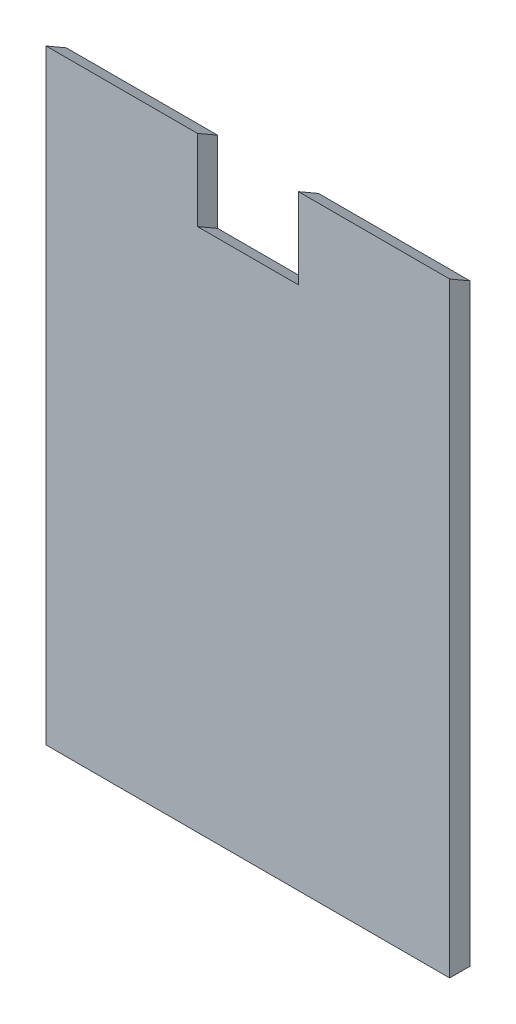
ISO-10303-21;
HEADER;
FILE_DESCRIPTION(('STEP AP214'),'2;1');
FILE_NAME('part.step','',(''),(''),'','','');
FILE_SCHEMA(('AUTOMOTIVE_DESIGN { 1 0 10303 214 1 1 1 1 }'));
ENDSEC;
DATA;
#1=APPLICATION_CONTEXT('core data for automotive mechanical design processes');
#2=APPLICATION_PROTOCOL_DEFINITION('international standard','automotive_design',2000,#1);
#3=PRODUCT_CONTEXT('',#1,'mechanical');
#4=PRODUCT('Part','Part','',(#3));
#5=PRODUCT_RELATED_PRODUCT_CATEGORY('part','',(#4));
#6=PRODUCT_DEFINITION_FORMATION('','',#4);
#7=PRODUCT_DEFINITION_CONTEXT('part definition',#1,'design');
#8=PRODUCT_DEFINITION('design','',#6,#7);
#9=PRODUCT_DEFINITION_SHAPE('','',#8);
#10=(LENGTH_UNIT() NAMED_UNIT(*) SI_UNIT(.MILLI.,.METRE.));
#11=(NAMED_UNIT(*) PLANE_ANGLE_UNIT() SI_UNIT($,.RADIAN.));
#12=(NAMED_UNIT(*) SI_UNIT($,.STERADIAN.) SOLID_ANGLE_UNIT());
#13=UNCERTAINTY_MEASURE_WITH_UNIT(LENGTH_MEASURE(1.E-05),#10,'distance_accuracy_value','');
#14=(GEOMETRIC_REPRESENTATION_CONTEXT(3) GLOBAL_UNCERTAINTY_ASSIGNED_CONTEXT((#13)) GLOBAL_UNIT_ASSIGNED_CONTEXT((#10,
#11,#12)) REPRESENTATION_CONTEXT('',''));
#15=CARTESIAN_POINT('',(0.,0.,0.));
#16=DIRECTION('',(0.,0.,1.));
#17=DIRECTION('',(1.,0.,0.));
#18=AXIS2_PLACEMENT_3D('',#15,#16,#17);
#19=CARTESIAN_POINT('',(-127.,-190.5,6.35));
#20=DIRECTION('',(1.,0.,0.));
#21=DIRECTION('',(0.,0.,-1.));
#22=AXIS2_PLACEMENT_3D('',#19,#20,#21);
#23=PLANE('',#22);
#24=DIRECTION('',(0.,-1.,0.));
#25=VECTOR('',#24,1.);
#26=CARTESIAN_POINT('',(-127.,-190.5,6.35));
#27=LINE('',#26,#25);
#28=CARTESIAN_POINT('',(-127.,190.5,6.35));
#29=VERTEX_POINT('',#28);
#30=CARTESIAN_POINT('',(-127.,-190.5,6.35));
#31=VERTEX_POINT('',#30);
#32=EDGE_CURVE('E106',#29,#31,#27,.T.);
#33=ORIENTED_EDGE('',*,*,#32,.F.);
#34=DIRECTION('',(0.,-0.500000000000002,-0.866025403784438));
#35=VECTOR('',#34,1.);
#36=CARTESIAN_POINT('',(-127.,190.5,6.35));
#37=LINE('',#36,#35);
#38=CARTESIAN_POINT('',(-127.,183.167651581292,-6.35));
#39=VERTEX_POINT('',#38);
#40=EDGE_CURVE('E96',#29,#39,#37,.T.);
#41=ORIENTED_EDGE('',*,*,#40,.T.);
#42=DIRECTION('',(0.,-1.,0.));
#43=VECTOR('',#42,1.);
#44=CARTESIAN_POINT('',(-127.,-190.5,-6.35));
#45=LINE('',#44,#43);
#46=CARTESIAN_POINT('',(-127.,-190.5,-6.35));
#47=VERTEX_POINT('',#46);
#48=EDGE_CURVE('E104',#39,#47,#45,.T.);
#49=ORIENTED_EDGE('',*,*,#48,.T.);
#50=DIRECTION('',(0.,0.,-1.));
#51=VECTOR('',#50,1.);
#52=CARTESIAN_POINT('',(-127.,-190.5,6.35));
#53=LINE('',#52,#51);
#54=EDGE_CURVE('E40',#31,#47,#53,.T.);
#55=ORIENTED_EDGE('',*,*,#54,.F.);
#56=EDGE_LOOP('',(#33,#41,#49,#55));
#57=FACE_BOUND('',#56,.T.);
#58=ADVANCED_FACE('F33',(#57),#23,.F.);
#59=CARTESIAN_POINT('',(127.,-190.5,6.35));
#60=DIRECTION('',(0.,1.,0.));
#61=DIRECTION('',(-1.,0.,0.));
#62=AXIS2_PLACEMENT_3D('',#59,#60,#61);
#63=PLANE('',#62);
#64=DIRECTION('',(1.,0.,0.));
#65=VECTOR('',#64,1.);
#66=CARTESIAN_POINT('',(127.,-190.5,-6.35));
#67=LINE('',#66,#65);
#68=CARTESIAN_POINT('',(127.,-190.5,-6.35));
#69=VERTEX_POINT('',#68);
#70=EDGE_CURVE('E112',#47,#69,#67,.T.);
#71=ORIENTED_EDGE('',*,*,#70,.T.);
#72=DIRECTION('',(0.,0.,-1.));
#73=VECTOR('',#72,1.);
#74=CARTESIAN_POINT('',(127.,-190.5,6.35));
#75=LINE('',#74,#73);
#76=CARTESIAN_POINT('',(127.,-190.5,6.35));
#77=VERTEX_POINT('',#76);
#78=EDGE_CURVE('E131',#77,#69,#75,.T.);
#79=ORIENTED_EDGE('',*,*,#78,.F.);
#80=DIRECTION('',(1.,0.,0.));
#81=VECTOR('',#80,1.);
#82=CARTESIAN_POINT('',(127.,-190.5,6.35));
#83=LINE('',#82,#81);
#84=EDGE_CURVE('E137',#31,#77,#83,.T.);
#85=ORIENTED_EDGE('',*,*,#84,.F.);
#86=ORIENTED_EDGE('',*,*,#54,.T.);
#87=EDGE_LOOP('',(#71,#79,#85,#86));
#88=FACE_BOUND('',#87,.T.);
#89=ADVANCED_FACE('F135',(#88),#63,.F.);
#90=CARTESIAN_POINT('',(127.,-190.5,6.35));
#91=DIRECTION('',(-1.,0.,0.));
#92=DIRECTION('',(0.,0.,1.));
#93=AXIS2_PLACEMENT_3D('',#90,#91,#92);
#94=PLANE('',#93);
#95=DIRECTION('',(0.,1.,0.));
#96=VECTOR('',#95,1.);
#97=CARTESIAN_POINT('',(127.,-190.5,-6.35));
#98=LINE('',#97,#96);
#99=CARTESIAN_POINT('',(127.,183.167651581292,-6.35));
#100=VERTEX_POINT('',#99);
#101=EDGE_CURVE('E115',#69,#100,#98,.T.);
#102=ORIENTED_EDGE('',*,*,#101,.T.);
#103=DIRECTION('',(0.,-0.500000000000002,-0.866025403784438));
#104=VECTOR('',#103,1.);
#105=CARTESIAN_POINT('',(127.,190.5,6.35));
#106=LINE('',#105,#104);
#107=CARTESIAN_POINT('',(127.,190.5,6.35));
#108=VERTEX_POINT('',#107);
#109=EDGE_CURVE('E46',#108,#100,#106,.T.);
#110=ORIENTED_EDGE('',*,*,#109,.F.);
#111=DIRECTION('',(0.,1.,0.));
#112=VECTOR('',#111,1.);
#113=CARTESIAN_POINT('',(127.,-190.5,6.35));
#114=LINE('',#113,#112);
#115=EDGE_CURVE('E141',#77,#108,#114,.T.);
#116=ORIENTED_EDGE('',*,*,#115,.F.);
#117=ORIENTED_EDGE('',*,*,#78,.T.);
#118=EDGE_LOOP('',(#102,#110,#116,#117));
#119=FACE_BOUND('',#118,.T.);
#120=ADVANCED_FACE('F179',(#119),#94,.F.);
#121=CARTESIAN_POINT('',(31.75,139.7,6.35));
#122=DIRECTION('',(1.,0.,0.));
#123=DIRECTION('',(0.,1.,0.));
#124=AXIS2_PLACEMENT_3D('',#121,#122,#123);
#125=PLANE('',#124);
#126=DIRECTION('',(0.,-1.,0.));
#127=VECTOR('',#126,1.);
#128=CARTESIAN_POINT('',(31.75,139.7,6.35));
#129=LINE('',#128,#127);
#130=CARTESIAN_POINT('',(31.7499999999998,190.5,6.35));
#131=VERTEX_POINT('',#130);
#132=CARTESIAN_POINT('',(31.75,139.7,6.35));
#133=VERTEX_POINT('',#132);
#134=EDGE_CURVE('E150',#131,#133,#129,.T.);
#135=ORIENTED_EDGE('',*,*,#134,.F.);
#136=DIRECTION('',(0.,-0.500000000000002,-0.866025403784438));
#137=VECTOR('',#136,1.);
#138=CARTESIAN_POINT('',(31.7499999999999,177.8,-15.6470452561248));
#139=LINE('',#138,#137);
#140=CARTESIAN_POINT('',(31.7499999999999,183.167651581292,-6.35));
#141=VERTEX_POINT('',#140);
#142=EDGE_CURVE('E160',#131,#141,#139,.T.);
#143=ORIENTED_EDGE('',*,*,#142,.T.);
#144=DIRECTION('',(0.,-1.,0.));
#145=VECTOR('',#144,1.);
#146=CARTESIAN_POINT('',(31.75,139.7,-6.35));
#147=LINE('',#146,#145);
#148=CARTESIAN_POINT('',(31.75,132.367651581292,-6.35));
#149=VERTEX_POINT('',#148);
#150=EDGE_CURVE('E126',#141,#149,#147,.T.);
#151=ORIENTED_EDGE('',*,*,#150,.T.);
#152=DIRECTION('',(0.,-0.500000000000002,-0.866025403784438));
#153=VECTOR('',#152,1.);
#154=CARTESIAN_POINT('',(31.75,139.7,6.35));
#155=LINE('',#154,#153);
#156=EDGE_CURVE('E163',#133,#149,#155,.T.);
#157=ORIENTED_EDGE('',*,*,#156,.F.);
#158=EDGE_LOOP('',(#135,#143,#151,#157));
#159=FACE_BOUND('',#158,.T.);
#160=ADVANCED_FACE('F176',(#159),#125,.F.);
#161=CARTESIAN_POINT('',(-31.75,139.7,6.35));
#162=DIRECTION('',(-1.,0.,0.));
#163=DIRECTION('',(0.,-1.,0.));
#164=AXIS2_PLACEMENT_3D('',#161,#162,#163);
#165=PLANE('',#164);
#166=DIRECTION('',(0.,1.,0.));
#167=VECTOR('',#166,1.);
#168=CARTESIAN_POINT('',(-31.75,139.7,-6.35));
#169=LINE('',#168,#167);
#170=CARTESIAN_POINT('',(-31.75,132.367651581292,-6.35));
#171=VERTEX_POINT('',#170);
#172=CARTESIAN_POINT('',(-31.7500000000001,183.167651581292,-6.35));
#173=VERTEX_POINT('',#172);
#174=EDGE_CURVE('E128',#171,#173,#169,.T.);
#175=ORIENTED_EDGE('',*,*,#174,.T.);
#176=DIRECTION('',(0.,0.500000000000002,0.866025403784438));
#177=VECTOR('',#176,1.);
#178=CARTESIAN_POINT('',(-31.7500000000001,177.8,-15.6470452561248));
#179=LINE('',#178,#177);
#180=CARTESIAN_POINT('',(-31.7500000000002,190.5,6.35));
#181=VERTEX_POINT('',#180);
#182=EDGE_CURVE('E54',#173,#181,#179,.T.);
#183=ORIENTED_EDGE('',*,*,#182,.T.);
#184=DIRECTION('',(0.,1.,0.));
#185=VECTOR('',#184,1.);
#186=CARTESIAN_POINT('',(-31.75,139.7,6.35));
#187=LINE('',#186,#185);
#188=CARTESIAN_POINT('',(-31.75,139.7,6.35));
#189=VERTEX_POINT('',#188);
#190=EDGE_CURVE('E121',#189,#181,#187,.T.);
#191=ORIENTED_EDGE('',*,*,#190,.F.);
#192=DIRECTION('',(0.,-0.500000000000002,-0.866025403784438));
#193=VECTOR('',#192,1.);
#194=CARTESIAN_POINT('',(-31.75,139.7,6.35));
#195=LINE('',#194,#193);
#196=EDGE_CURVE('E118',#189,#171,#195,.T.);
#197=ORIENTED_EDGE('',*,*,#196,.T.);
#198=EDGE_LOOP('',(#175,#183,#191,#197));
#199=FACE_BOUND('',#198,.T.);
#200=ADVANCED_FACE('F159',(#199),#165,.F.);
#201=CARTESIAN_POINT('',(0.,0.,6.35));
#202=DIRECTION('',(0.,0.,-1.));
#203=DIRECTION('',(-1.,0.,0.));
#204=AXIS2_PLACEMENT_3D('',#201,#202,#203);
#205=PLANE('',#204);
#206=DIRECTION('',(-1.,0.,0.));
#207=VECTOR('',#206,1.);
#208=CARTESIAN_POINT('',(-31.7500000000002,190.5,6.35));
#209=LINE('',#208,#207);
#210=EDGE_CURVE('E130',#181,#29,#209,.T.);
#211=ORIENTED_EDGE('',*,*,#210,.T.);
#212=ORIENTED_EDGE('',*,*,#32,.T.);
#213=ORIENTED_EDGE('',*,*,#84,.T.);
#214=ORIENTED_EDGE('',*,*,#115,.T.);
#215=DIRECTION('',(-1.,0.,0.));
#216=VECTOR('',#215,1.);
#217=CARTESIAN_POINT('',(127.,190.5,6.35));
#218=LINE('',#217,#216);
#219=EDGE_CURVE('E143',#108,#131,#218,.T.);
#220=ORIENTED_EDGE('',*,*,#219,.T.);
#221=ORIENTED_EDGE('',*,*,#134,.T.);
#222=DIRECTION('',(-1.,0.,0.));
#223=VECTOR('',#222,1.);
#224=CARTESIAN_POINT('',(-31.75,139.7,6.35));
#225=LINE('',#224,#223);
#226=EDGE_CURVE('E152',#133,#189,#225,.T.);
#227=ORIENTED_EDGE('',*,*,#226,.T.);
#228=ORIENTED_EDGE('',*,*,#190,.T.);
#229=EDGE_LOOP('',(#211,#212,#213,#214,#220,#221,#227,#228));
#230=FACE_BOUND('',#229,.T.);
#231=ADVANCED_FACE('F156',(#230),#205,.F.);
#232=CARTESIAN_POINT('',(0.,0.,-6.35));
#233=DIRECTION('',(0.,0.,-1.));
#234=DIRECTION('',(-1.,0.,0.));
#235=AXIS2_PLACEMENT_3D('',#232,#233,#234);
#236=PLANE('',#235);
#237=DIRECTION('',(-1.,0.,0.));
#238=VECTOR('',#237,1.);
#239=CARTESIAN_POINT('',(0.,183.167651581292,-6.35));
#240=LINE('',#239,#238);
#241=EDGE_CURVE('E11',#100,#141,#240,.T.);
#242=ORIENTED_EDGE('',*,*,#241,.F.);
#243=ORIENTED_EDGE('',*,*,#101,.F.);
#244=ORIENTED_EDGE('',*,*,#70,.F.);
#245=ORIENTED_EDGE('',*,*,#48,.F.);
#246=DIRECTION('',(1.,0.,0.));
#247=VECTOR('',#246,1.);
#248=CARTESIAN_POINT('',(-127.,183.167651581292,-6.35));
#249=LINE('',#248,#247);
#250=EDGE_CURVE('E93',#39,#173,#249,.T.);
#251=ORIENTED_EDGE('',*,*,#250,.T.);
#252=ORIENTED_EDGE('',*,*,#174,.F.);
#253=DIRECTION('',(1.,0.,0.));
#254=VECTOR('',#253,1.);
#255=CARTESIAN_POINT('',(-31.75,132.367651581292,-6.35));
#256=LINE('',#255,#254);
#257=EDGE_CURVE('E113',#171,#149,#256,.T.);
#258=ORIENTED_EDGE('',*,*,#257,.T.);
#259=ORIENTED_EDGE('',*,*,#150,.F.);
#260=EDGE_LOOP('',(#242,#243,#244,#245,#251,#252,#258,#259));
#261=FACE_BOUND('',#260,.T.);
#262=ADVANCED_FACE('F110',(#261),#236,.T.);
#263=CARTESIAN_POINT('',(-31.75,139.7,6.35));
#264=DIRECTION('',(0.,-0.866025403784438,0.500000000000002));
#265=DIRECTION('',(0.,-0.500000000000002,-0.866025403784438));
#266=AXIS2_PLACEMENT_3D('',#263,#264,#265);
#267=PLANE('',#266);
#268=ORIENTED_EDGE('',*,*,#156,.T.);
#269=ORIENTED_EDGE('',*,*,#257,.F.);
#270=ORIENTED_EDGE('',*,*,#196,.F.);
#271=ORIENTED_EDGE('',*,*,#226,.F.);
#272=EDGE_LOOP('',(#268,#269,#270,#271));
#273=FACE_BOUND('',#272,.T.);
#274=ADVANCED_FACE('F172',(#273),#267,.F.);
#275=CARTESIAN_POINT('',(-127.,190.5,6.35));
#276=DIRECTION('',(0.,-0.866025403784438,0.500000000000002));
#277=DIRECTION('',(0.,-0.500000000000002,-0.866025403784438));
#278=AXIS2_PLACEMENT_3D('',#275,#276,#277);
#279=PLANE('',#278);
#280=ORIENTED_EDGE('',*,*,#250,.F.);
#281=ORIENTED_EDGE('',*,*,#40,.F.);
#282=ORIENTED_EDGE('',*,*,#210,.F.);
#283=ORIENTED_EDGE('',*,*,#182,.F.);
#284=EDGE_LOOP('',(#280,#281,#282,#283));
#285=FACE_BOUND('',#284,.T.);
#286=ADVANCED_FACE('F95',(#285),#279,.F.);
#287=ORIENTED_EDGE('',*,*,#219,.F.);
#288=ORIENTED_EDGE('',*,*,#109,.T.);
#289=ORIENTED_EDGE('',*,*,#241,.T.);
#290=ORIENTED_EDGE('',*,*,#142,.F.);
#291=EDGE_LOOP('',(#287,#288,#289,#290));
#292=FACE_BOUND('',#291,.T.);
#293=ADVANCED_FACE('F177',(#292),#279,.F.);
#294=CLOSED_SHELL('',(#58,#89,#120,#160,#200,#231,#262,#274,#286,#293));
#295=MANIFOLD_SOLID_BREP('B2',#294);
#296=ADVANCED_BREP_SHAPE_REPRESENTATION('',(#18,#295),#14);
#297=SHAPE_DEFINITION_REPRESENTATION(#9,#296);
ENDSEC;
END-ISO-10303-21;
